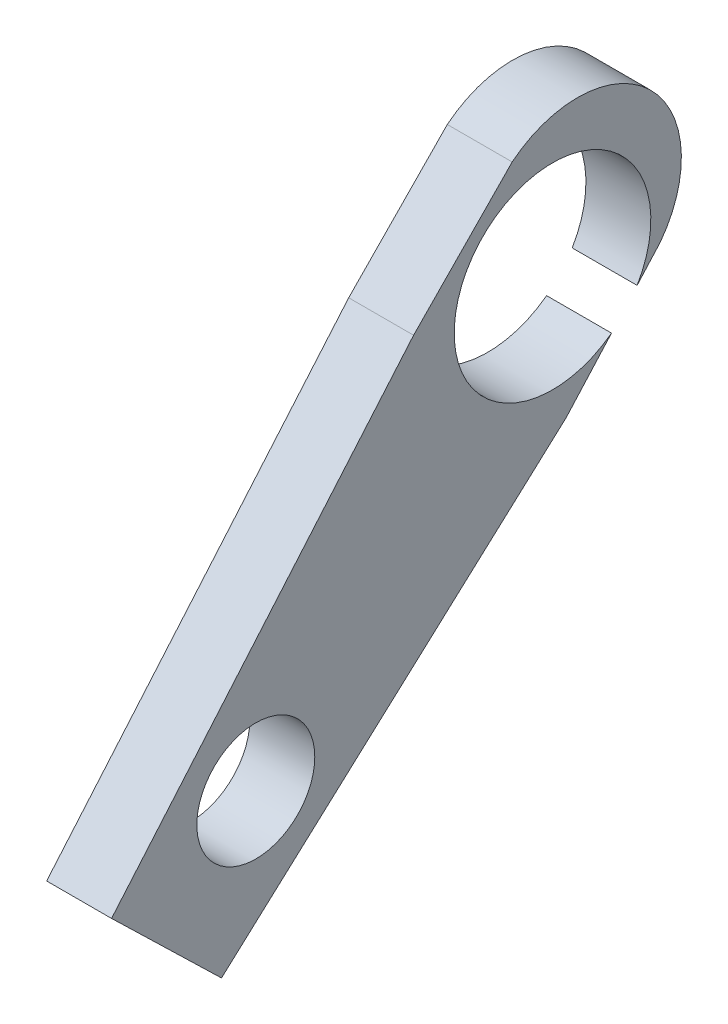
ISO-10303-21;
HEADER;
FILE_DESCRIPTION(('STEP AP214'),'2;1');
FILE_NAME('part.step','',(''),(''),'','','');
FILE_SCHEMA(('AUTOMOTIVE_DESIGN { 1 0 10303 214 1 1 1 1 }'));
ENDSEC;
DATA;
#1=APPLICATION_CONTEXT('core data for automotive mechanical design processes');
#2=APPLICATION_PROTOCOL_DEFINITION('international standard','automotive_design',2000,#1);
#3=PRODUCT_CONTEXT('',#1,'mechanical');
#4=PRODUCT('Part','Part','',(#3));
#5=PRODUCT_RELATED_PRODUCT_CATEGORY('part','',(#4));
#6=PRODUCT_DEFINITION_FORMATION('','',#4);
#7=PRODUCT_DEFINITION_CONTEXT('part definition',#1,'design');
#8=PRODUCT_DEFINITION('design','',#6,#7);
#9=PRODUCT_DEFINITION_SHAPE('','',#8);
#10=(LENGTH_UNIT() NAMED_UNIT(*) SI_UNIT(.MILLI.,.METRE.));
#11=(NAMED_UNIT(*) PLANE_ANGLE_UNIT() SI_UNIT($,.RADIAN.));
#12=(NAMED_UNIT(*) SI_UNIT($,.STERADIAN.) SOLID_ANGLE_UNIT());
#13=UNCERTAINTY_MEASURE_WITH_UNIT(LENGTH_MEASURE(1.E-05),#10,'distance_accuracy_value','');
#14=(GEOMETRIC_REPRESENTATION_CONTEXT(3) GLOBAL_UNCERTAINTY_ASSIGNED_CONTEXT((#13)) GLOBAL_UNIT_ASSIGNED_CONTEXT((#10,
#11,#12)) REPRESENTATION_CONTEXT('',''));
#15=CARTESIAN_POINT('',(0.,0.,0.));
#16=DIRECTION('',(0.,0.,1.));
#17=DIRECTION('',(1.,0.,0.));
#18=AXIS2_PLACEMENT_3D('',#15,#16,#17);
#19=CARTESIAN_POINT('',(14.713458,330.870306,75.57643));
#20=DIRECTION('',(-1.,0.,0.));
#21=DIRECTION('',(0.,0.,1.));
#22=AXIS2_PLACEMENT_3D('',#19,#20,#21);
#23=CYLINDRICAL_SURFACE('',#22,22.2927786426556);
#24=CARTESIAN_POINT('',(0.,330.870306,75.57643));
#25=DIRECTION('',(1.,0.,0.));
#26=DIRECTION('',(0.,0.,-1.));
#27=AXIS2_PLACEMENT_3D('',#24,#25,#26);
#28=CIRCLE('',#27,22.2927786426556);
#29=CARTESIAN_POINT('',(0.,319.503076539817,56.3995148672165));
#30=VERTEX_POINT('',#29);
#31=CARTESIAN_POINT('',(0.,313.035896530406,62.201011558647));
#32=VERTEX_POINT('',#31);
#33=EDGE_CURVE('E151',#30,#32,#28,.T.);
#34=ORIENTED_EDGE('',*,*,#33,.F.);
#35=DIRECTION('',(-1.,0.,0.));
#36=VECTOR('',#35,1.);
#37=CARTESIAN_POINT('',(14.713458,319.503076539817,56.3995148672165));
#38=LINE('',#37,#36);
#39=CARTESIAN_POINT('',(14.713458,319.503076539817,56.3995148672165));
#40=VERTEX_POINT('',#39);
#41=EDGE_CURVE('E11',#40,#30,#38,.T.);
#42=ORIENTED_EDGE('',*,*,#41,.F.);
#43=CARTESIAN_POINT('',(14.713458,330.870306,75.57643));
#44=DIRECTION('',(1.,0.,0.));
#45=DIRECTION('',(0.,0.,-1.));
#46=AXIS2_PLACEMENT_3D('',#43,#44,#45);
#47=CIRCLE('',#46,22.2927786426556);
#48=CARTESIAN_POINT('',(14.713458,313.035896530406,62.201011558647));
#49=VERTEX_POINT('',#48);
#50=EDGE_CURVE('E169',#40,#49,#47,.T.);
#51=ORIENTED_EDGE('',*,*,#50,.T.);
#52=DIRECTION('',(-1.,0.,0.));
#53=VECTOR('',#52,1.);
#54=CARTESIAN_POINT('',(14.713458,313.035896530406,62.201011558647));
#55=LINE('',#54,#53);
#56=EDGE_CURVE('E86',#49,#32,#55,.T.);
#57=ORIENTED_EDGE('',*,*,#56,.T.);
#58=EDGE_LOOP('',(#34,#42,#51,#57));
#59=FACE_BOUND('',#58,.T.);
#60=ADVANCED_FACE('F35',(#59),#23,.F.);
#61=CARTESIAN_POINT('',(14.713458,170.500785059365,190.064620799243));
#62=DIRECTION('',(0.,0.667757814504057,0.744378600692394));
#63=DIRECTION('',(0.,-0.744378600692394,0.667757814504057));
#64=AXIS2_PLACEMENT_3D('',#61,#62,#63);
#65=PLANE('',#64);
#66=DIRECTION('',(0.,0.744378600692394,-0.667757814504057));
#67=VECTOR('',#66,1.);
#68=CARTESIAN_POINT('',(0.,170.500785059365,190.064620799243));
#69=LINE('',#68,#67);
#70=CARTESIAN_POINT('',(0.,325.36257,51.1431540000001));
#71=VERTEX_POINT('',#70);
#72=EDGE_CURVE('E149',#30,#71,#69,.T.);
#73=ORIENTED_EDGE('',*,*,#72,.T.);
#74=DIRECTION('',(-1.,0.,0.));
#75=VECTOR('',#74,1.);
#76=CARTESIAN_POINT('',(14.713458,325.36257,51.1431540000001));
#77=LINE('',#76,#75);
#78=CARTESIAN_POINT('',(14.713458,325.36257,51.1431540000001));
#79=VERTEX_POINT('',#78);
#80=EDGE_CURVE('E44',#79,#71,#77,.T.);
#81=ORIENTED_EDGE('',*,*,#80,.F.);
#82=DIRECTION('',(0.,0.744378600692394,-0.667757814504057));
#83=VECTOR('',#82,1.);
#84=CARTESIAN_POINT('',(14.713458,170.500785059365,190.064620799243));
#85=LINE('',#84,#83);
#86=EDGE_CURVE('E166',#40,#79,#85,.T.);
#87=ORIENTED_EDGE('',*,*,#86,.F.);
#88=ORIENTED_EDGE('',*,*,#41,.T.);
#89=EDGE_LOOP('',(#73,#81,#87,#88));
#90=FACE_BOUND('',#89,.T.);
#91=ADVANCED_FACE('F150',(#90),#65,.F.);
#92=CARTESIAN_POINT('',(14.713458,339.587879108143,69.9155990695663));
#93=DIRECTION('',(-1.,0.,0.));
#94=DIRECTION('',(0.,0.,1.));
#95=AXIS2_PLACEMENT_3D('',#92,#93,#94);
#96=CYLINDRICAL_SURFACE('',#95,23.5534310263301);
#97=CARTESIAN_POINT('',(0.,339.587879108143,69.9155990695663));
#98=DIRECTION('',(1.,0.,0.));
#99=DIRECTION('',(0.,0.,-1.));
#100=AXIS2_PLACEMENT_3D('',#97,#98,#99);
#101=CIRCLE('',#100,23.5534310263301);
#102=CARTESIAN_POINT('',(0.,357.904288,84.723478));
#103=VERTEX_POINT('',#102);
#104=EDGE_CURVE('E143',#103,#71,#101,.F.);
#105=ORIENTED_EDGE('',*,*,#104,.F.);
#106=DIRECTION('',(-1.,0.,0.));
#107=VECTOR('',#106,1.);
#108=CARTESIAN_POINT('',(14.713458,357.904288,84.723478));
#109=LINE('',#108,#107);
#110=CARTESIAN_POINT('',(14.713458,357.904288,84.723478));
#111=VERTEX_POINT('',#110);
#112=EDGE_CURVE('E135',#111,#103,#109,.T.);
#113=ORIENTED_EDGE('',*,*,#112,.F.);
#114=CARTESIAN_POINT('',(14.713458,339.587879108143,69.9155990695663));
#115=DIRECTION('',(1.,0.,0.));
#116=DIRECTION('',(0.,0.,-1.));
#117=AXIS2_PLACEMENT_3D('',#114,#115,#116);
#118=CIRCLE('',#117,23.5534310263301);
#119=EDGE_CURVE('E146',#111,#79,#118,.F.);
#120=ORIENTED_EDGE('',*,*,#119,.T.);
#121=ORIENTED_EDGE('',*,*,#80,.T.);
#122=EDGE_LOOP('',(#105,#113,#120,#121));
#123=FACE_BOUND('',#122,.T.);
#124=ADVANCED_FACE('F141',(#123),#96,.T.);
#125=CARTESIAN_POINT('',(14.713458,217.402515808786,222.194871878975));
#126=DIRECTION('',(0.,0.69935656269366,0.714772969702485));
#127=DIRECTION('',(0.,-0.714772969702485,0.69935656269366));
#128=AXIS2_PLACEMENT_3D('',#125,#126,#127);
#129=PLANE('',#128);
#130=DIRECTION('',(0.,0.714772969702485,-0.69935656269366));
#131=VECTOR('',#130,1.);
#132=CARTESIAN_POINT('',(0.,217.402515808786,222.194871878975));
#133=LINE('',#132,#131);
#134=CARTESIAN_POINT('',(0.,335.05775,107.077256));
#135=VERTEX_POINT('',#134);
#136=EDGE_CURVE('E156',#135,#103,#133,.T.);
#137=ORIENTED_EDGE('',*,*,#136,.F.);
#138=DIRECTION('',(-1.,0.,0.));
#139=VECTOR('',#138,1.);
#140=CARTESIAN_POINT('',(14.713458,335.05775,107.077256));
#141=LINE('',#140,#139);
#142=CARTESIAN_POINT('',(14.713458,335.05775,107.077256));
#143=VERTEX_POINT('',#142);
#144=EDGE_CURVE('E129',#143,#135,#141,.T.);
#145=ORIENTED_EDGE('',*,*,#144,.F.);
#146=DIRECTION('',(0.,0.714772969702485,-0.69935656269366));
#147=VECTOR('',#146,1.);
#148=CARTESIAN_POINT('',(14.713458,217.402515808786,222.194871878975));
#149=LINE('',#148,#147);
#150=EDGE_CURVE('E170',#143,#111,#149,.T.);
#151=ORIENTED_EDGE('',*,*,#150,.T.);
#152=ORIENTED_EDGE('',*,*,#112,.T.);
#153=EDGE_LOOP('',(#137,#145,#151,#152));
#154=FACE_BOUND('',#153,.T.);
#155=ADVANCED_FACE('F185',(#154),#129,.T.);
#156=CARTESIAN_POINT('',(14.713458,194.002455101343,227.41058722145));
#157=DIRECTION('',(0.,0.649013610338299,0.760776796173257));
#158=DIRECTION('',(0.,-0.760776796173257,0.649013610338299));
#159=AXIS2_PLACEMENT_3D('',#156,#157,#158);
#160=PLANE('',#159);
#161=DIRECTION('',(0.,0.760776796173257,-0.649013610338299));
#162=VECTOR('',#161,1.);
#163=CARTESIAN_POINT('',(0.,194.002455101343,227.41058722145));
#164=LINE('',#163,#162);
#165=CARTESIAN_POINT('',(0.,254.780796,175.56099));
#166=VERTEX_POINT('',#165);
#167=EDGE_CURVE('E158',#166,#135,#164,.T.);
#168=ORIENTED_EDGE('',*,*,#167,.F.);
#169=DIRECTION('',(-1.,0.,0.));
#170=VECTOR('',#169,1.);
#171=CARTESIAN_POINT('',(14.713458,254.780796,175.56099));
#172=LINE('',#171,#170);
#173=CARTESIAN_POINT('',(14.713458,254.780796,175.56099));
#174=VERTEX_POINT('',#173);
#175=EDGE_CURVE('E127',#174,#166,#172,.T.);
#176=ORIENTED_EDGE('',*,*,#175,.F.);
#177=DIRECTION('',(0.,0.760776796173257,-0.649013610338299));
#178=VECTOR('',#177,1.);
#179=CARTESIAN_POINT('',(14.713458,194.002455101343,227.41058722145));
#180=LINE('',#179,#178);
#181=EDGE_CURVE('E121',#174,#143,#180,.T.);
#182=ORIENTED_EDGE('',*,*,#181,.T.);
#183=ORIENTED_EDGE('',*,*,#144,.T.);
#184=EDGE_LOOP('',(#168,#176,#182,#183));
#185=FACE_BOUND('',#184,.T.);
#186=ADVANCED_FACE('F188',(#185),#160,.T.);
#187=CARTESIAN_POINT('',(14.713458,43.6560952711568,-42.3052280888842));
#188=DIRECTION('',(0.,0.718130173038377,-0.695908797596259));
#189=DIRECTION('',(0.,0.695908797596259,0.718130173038377));
#190=AXIS2_PLACEMENT_3D('',#187,#188,#189);
#191=PLANE('',#190);
#192=DIRECTION('',(0.,-0.695908797596259,-0.718130173038377));
#193=VECTOR('',#192,1.);
#194=CARTESIAN_POINT('',(0.,43.6560952711568,-42.3052280888842));
#195=LINE('',#194,#193);
#196=CARTESIAN_POINT('',(0.,230.622856,150.631652));
#197=VERTEX_POINT('',#196);
#198=EDGE_CURVE('E126',#166,#197,#195,.T.);
#199=ORIENTED_EDGE('',*,*,#198,.T.);
#200=DIRECTION('',(-1.,0.,0.));
#201=VECTOR('',#200,1.);
#202=CARTESIAN_POINT('',(14.713458,230.622856,150.631652));
#203=LINE('',#202,#201);
#204=CARTESIAN_POINT('',(14.713458,230.622856,150.631652));
#205=VERTEX_POINT('',#204);
#206=EDGE_CURVE('E111',#205,#197,#203,.T.);
#207=ORIENTED_EDGE('',*,*,#206,.F.);
#208=DIRECTION('',(0.,-0.695908797596259,-0.718130173038377));
#209=VECTOR('',#208,1.);
#210=CARTESIAN_POINT('',(14.713458,43.6560952711568,-42.3052280888842));
#211=LINE('',#210,#209);
#212=EDGE_CURVE('E114',#174,#205,#211,.T.);
#213=ORIENTED_EDGE('',*,*,#212,.F.);
#214=ORIENTED_EDGE('',*,*,#175,.T.);
#215=EDGE_LOOP('',(#199,#207,#213,#214));
#216=FACE_BOUND('',#215,.T.);
#217=ADVANCED_FACE('F124',(#216),#191,.F.);
#218=CARTESIAN_POINT('',(14.713458,201.389964272532,182.831800006842));
#219=DIRECTION('',(0.,0.740397351212837,0.672169444646969));
#220=DIRECTION('',(0.,-0.67216944464697,0.740397351212837));
#221=AXIS2_PLACEMENT_3D('',#218,#219,#220);
#222=PLANE('',#221);
#223=DIRECTION('',(0.,0.67216944464697,-0.740397351212837));
#224=VECTOR('',#223,1.);
#225=CARTESIAN_POINT('',(0.,201.389964272532,182.831800006842));
#226=LINE('',#225,#224);
#227=CARTESIAN_POINT('',(0.,301.552356,72.502522));
#228=VERTEX_POINT('',#227);
#229=EDGE_CURVE('E164',#197,#228,#226,.T.);
#230=ORIENTED_EDGE('',*,*,#229,.T.);
#231=DIRECTION('',(-1.,0.,0.));
#232=VECTOR('',#231,1.);
#233=CARTESIAN_POINT('',(14.713458,301.552356,72.502522));
#234=LINE('',#233,#232);
#235=CARTESIAN_POINT('',(14.713458,301.552356,72.502522));
#236=VERTEX_POINT('',#235);
#237=EDGE_CURVE('E113',#236,#228,#234,.T.);
#238=ORIENTED_EDGE('',*,*,#237,.F.);
#239=DIRECTION('',(0.,0.67216944464697,-0.740397351212837));
#240=VECTOR('',#239,1.);
#241=CARTESIAN_POINT('',(14.713458,201.389964272532,182.831800006842));
#242=LINE('',#241,#240);
#243=EDGE_CURVE('E106',#205,#236,#242,.T.);
#244=ORIENTED_EDGE('',*,*,#243,.F.);
#245=ORIENTED_EDGE('',*,*,#206,.T.);
#246=EDGE_LOOP('',(#230,#238,#244,#245));
#247=FACE_BOUND('',#246,.T.);
#248=ADVANCED_FACE('F109',(#247),#222,.F.);
#249=CARTESIAN_POINT('',(14.713458,263.47039,142.853156));
#250=DIRECTION('',(-1.,0.,0.));
#251=DIRECTION('',(0.,0.,1.));
#252=AXIS2_PLACEMENT_3D('',#249,#250,#251);
#253=CYLINDRICAL_SURFACE('',#252,13.3729718608486);
#254=CARTESIAN_POINT('',(14.713458,263.47039,142.853156));
#255=DIRECTION('',(1.,0.,0.));
#256=DIRECTION('',(0.,0.,-1.));
#257=AXIS2_PLACEMENT_3D('',#254,#255,#256);
#258=CIRCLE('',#257,13.3729718608486);
#259=CARTESIAN_POINT('',(14.713458,263.47039,129.480184139151));
#260=VERTEX_POINT('',#259);
#261=EDGE_CURVE('E171',#260,#260,#258,.T.);
#262=ORIENTED_EDGE('',*,*,#261,.T.);
#263=EDGE_LOOP('',(#262));
#264=FACE_BOUND('',#263,.T.);
#265=CARTESIAN_POINT('',(0.,263.47039,142.853156));
#266=DIRECTION('',(1.,0.,0.));
#267=DIRECTION('',(0.,0.,-1.));
#268=AXIS2_PLACEMENT_3D('',#265,#266,#267);
#269=CIRCLE('',#268,13.3729718608486);
#270=CARTESIAN_POINT('',(0.,263.47039,129.480184139151));
#271=VERTEX_POINT('',#270);
#272=EDGE_CURVE('E178',#271,#271,#269,.T.);
#273=ORIENTED_EDGE('',*,*,#272,.F.);
#274=EDGE_LOOP('',(#273));
#275=FACE_BOUND('',#274,.T.);
#276=ADVANCED_FACE('F37',(#264,#275),#253,.F.);
#277=EDGE_CURVE('E79',#228,#32,#69,.T.);
#278=ORIENTED_EDGE('',*,*,#277,.T.);
#279=ORIENTED_EDGE('',*,*,#56,.F.);
#280=EDGE_CURVE('E52',#236,#49,#85,.T.);
#281=ORIENTED_EDGE('',*,*,#280,.F.);
#282=ORIENTED_EDGE('',*,*,#237,.T.);
#283=EDGE_LOOP('',(#278,#279,#281,#282));
#284=FACE_BOUND('',#283,.T.);
#285=ADVANCED_FACE('F177',(#284),#65,.F.);
#286=CARTESIAN_POINT('',(14.713458,0.,0.));
#287=DIRECTION('',(1.,0.,0.));
#288=DIRECTION('',(0.,0.,-1.));
#289=AXIS2_PLACEMENT_3D('',#286,#287,#288);
#290=PLANE('',#289);
#291=ORIENTED_EDGE('',*,*,#261,.F.);
#292=EDGE_LOOP('',(#291));
#293=FACE_BOUND('',#292,.T.);
#294=ORIENTED_EDGE('',*,*,#50,.F.);
#295=ORIENTED_EDGE('',*,*,#86,.T.);
#296=ORIENTED_EDGE('',*,*,#119,.F.);
#297=ORIENTED_EDGE('',*,*,#150,.F.);
#298=ORIENTED_EDGE('',*,*,#181,.F.);
#299=ORIENTED_EDGE('',*,*,#212,.T.);
#300=ORIENTED_EDGE('',*,*,#243,.T.);
#301=ORIENTED_EDGE('',*,*,#280,.T.);
#302=EDGE_LOOP('',(#294,#295,#296,#297,#298,#299,#300,#301));
#303=FACE_BOUND('',#302,.T.);
#304=ADVANCED_FACE('F118',(#293,#303),#290,.T.);
#305=CARTESIAN_POINT('',(0.,0.,0.));
#306=DIRECTION('',(1.,0.,0.));
#307=DIRECTION('',(0.,0.,-1.));
#308=AXIS2_PLACEMENT_3D('',#305,#306,#307);
#309=PLANE('',#308);
#310=ORIENTED_EDGE('',*,*,#272,.T.);
#311=EDGE_LOOP('',(#310));
#312=FACE_BOUND('',#311,.T.);
#313=ORIENTED_EDGE('',*,*,#33,.T.);
#314=ORIENTED_EDGE('',*,*,#277,.F.);
#315=ORIENTED_EDGE('',*,*,#229,.F.);
#316=ORIENTED_EDGE('',*,*,#198,.F.);
#317=ORIENTED_EDGE('',*,*,#167,.T.);
#318=ORIENTED_EDGE('',*,*,#136,.T.);
#319=ORIENTED_EDGE('',*,*,#104,.T.);
#320=ORIENTED_EDGE('',*,*,#72,.F.);
#321=EDGE_LOOP('',(#313,#314,#315,#316,#317,#318,#319,#320));
#322=FACE_BOUND('',#321,.T.);
#323=ADVANCED_FACE('F153',(#312,#322),#309,.F.);
#324=CLOSED_SHELL('',(#60,#91,#124,#155,#186,#217,#248,#276,#285,#304,#323));
#325=MANIFOLD_SOLID_BREP('B2',#324);
#326=ADVANCED_BREP_SHAPE_REPRESENTATION('',(#18,#325),#14);
#327=SHAPE_DEFINITION_REPRESENTATION(#9,#326);
ENDSEC;
END-ISO-10303-21;
